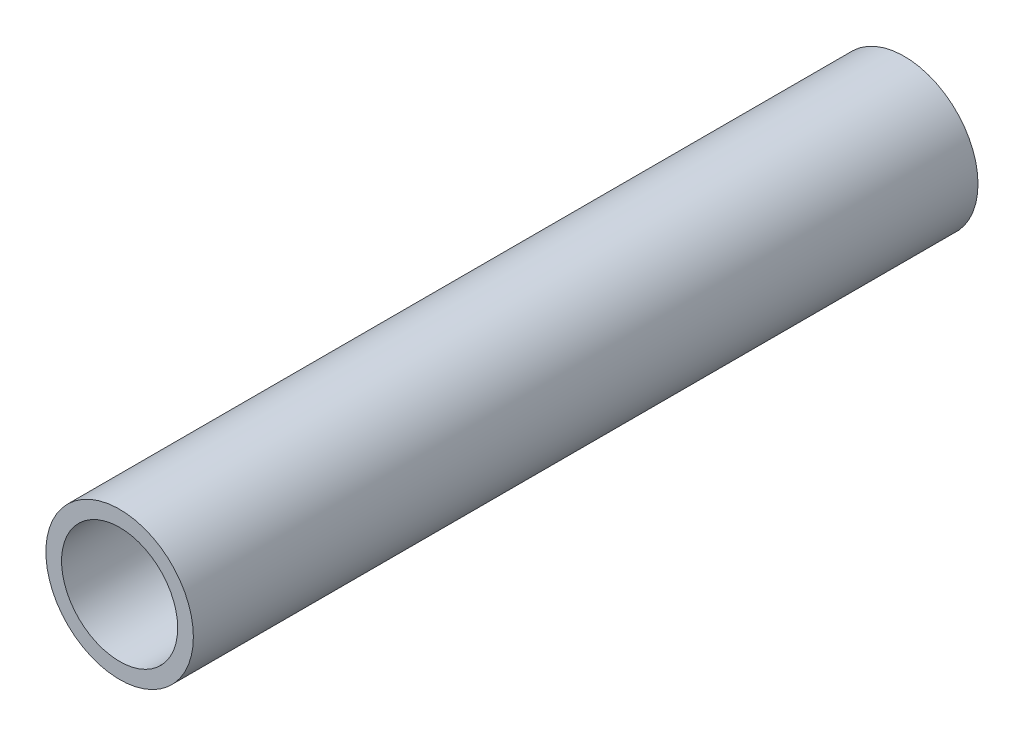
ISO-10303-21;
HEADER;
FILE_DESCRIPTION(('STEP AP214'),'2;1');
FILE_NAME('part.step','',(''),(''),'','','');
FILE_SCHEMA(('AUTOMOTIVE_DESIGN { 1 0 10303 214 1 1 1 1 }'));
ENDSEC;
DATA;
#1=APPLICATION_CONTEXT('core data for automotive mechanical design processes');
#2=APPLICATION_PROTOCOL_DEFINITION('international standard','automotive_design',2000,#1);
#3=PRODUCT_CONTEXT('',#1,'mechanical');
#4=PRODUCT('Part','Part','',(#3));
#5=PRODUCT_RELATED_PRODUCT_CATEGORY('part','',(#4));
#6=PRODUCT_DEFINITION_FORMATION('','',#4);
#7=PRODUCT_DEFINITION_CONTEXT('part definition',#1,'design');
#8=PRODUCT_DEFINITION('design','',#6,#7);
#9=PRODUCT_DEFINITION_SHAPE('','',#8);
#10=(LENGTH_UNIT() NAMED_UNIT(*) SI_UNIT(.MILLI.,.METRE.));
#11=(NAMED_UNIT(*) PLANE_ANGLE_UNIT() SI_UNIT($,.RADIAN.));
#12=(NAMED_UNIT(*) SI_UNIT($,.STERADIAN.) SOLID_ANGLE_UNIT());
#13=UNCERTAINTY_MEASURE_WITH_UNIT(LENGTH_MEASURE(1.E-05),#10,'distance_accuracy_value','');
#14=(GEOMETRIC_REPRESENTATION_CONTEXT(3) GLOBAL_UNCERTAINTY_ASSIGNED_CONTEXT((#13)) GLOBAL_UNIT_ASSIGNED_CONTEXT((#10,
#11,#12)) REPRESENTATION_CONTEXT('',''));
#15=CARTESIAN_POINT('',(0.,0.,0.));
#16=DIRECTION('',(0.,0.,1.));
#17=DIRECTION('',(1.,0.,0.));
#18=AXIS2_PLACEMENT_3D('',#15,#16,#17);
#19=CARTESIAN_POINT('',(0.,0.,12.7));
#20=DIRECTION('',(0.,0.,-1.));
#21=DIRECTION('',(-1.,0.,0.));
#22=AXIS2_PLACEMENT_3D('',#19,#20,#21);
#23=CYLINDRICAL_SURFACE('',#22,1.1938);
#24=CARTESIAN_POINT('',(0.,0.,12.7));
#25=DIRECTION('',(0.,0.,1.));
#26=DIRECTION('',(1.,0.,0.));
#27=AXIS2_PLACEMENT_3D('',#24,#25,#26);
#28=CIRCLE('',#27,1.1938);
#29=CARTESIAN_POINT('',(1.1938,0.,12.7));
#30=VERTEX_POINT('',#29);
#31=EDGE_CURVE('E10',#30,#30,#28,.T.);
#32=ORIENTED_EDGE('',*,*,#31,.F.);
#33=EDGE_LOOP('',(#32));
#34=FACE_BOUND('',#33,.T.);
#35=CARTESIAN_POINT('',(0.,0.,0.));
#36=DIRECTION('',(0.,0.,1.));
#37=DIRECTION('',(1.,0.,0.));
#38=AXIS2_PLACEMENT_3D('',#35,#36,#37);
#39=CIRCLE('',#38,1.1938);
#40=CARTESIAN_POINT('',(1.1938,0.,0.));
#41=VERTEX_POINT('',#40);
#42=EDGE_CURVE('E35',#41,#41,#39,.T.);
#43=ORIENTED_EDGE('',*,*,#42,.T.);
#44=EDGE_LOOP('',(#43));
#45=FACE_BOUND('',#44,.T.);
#46=ADVANCED_FACE('F32',(#34,#45),#23,.T.);
#47=CARTESIAN_POINT('',(0.,0.,12.7));
#48=DIRECTION('',(0.,0.,1.));
#49=DIRECTION('',(1.,0.,0.));
#50=AXIS2_PLACEMENT_3D('',#47,#48,#49);
#51=PLANE('',#50);
#52=CARTESIAN_POINT('',(0.,0.,12.7));
#53=DIRECTION('',(0.,0.,1.));
#54=DIRECTION('',(1.,0.,0.));
#55=AXIS2_PLACEMENT_3D('',#52,#53,#54);
#56=CIRCLE('',#55,0.9398);
#57=CARTESIAN_POINT('',(0.9398,0.,12.7));
#58=VERTEX_POINT('',#57);
#59=EDGE_CURVE('E42',#58,#58,#56,.T.);
#60=ORIENTED_EDGE('',*,*,#59,.F.);
#61=EDGE_LOOP('',(#60));
#62=FACE_BOUND('',#61,.T.);
#63=ORIENTED_EDGE('',*,*,#31,.T.);
#64=EDGE_LOOP('',(#63));
#65=FACE_BOUND('',#64,.T.);
#66=ADVANCED_FACE('F53',(#62,#65),#51,.T.);
#67=CARTESIAN_POINT('',(0.,0.,0.));
#68=DIRECTION('',(0.,0.,1.));
#69=DIRECTION('',(1.,0.,0.));
#70=AXIS2_PLACEMENT_3D('',#67,#68,#69);
#71=PLANE('',#70);
#72=CARTESIAN_POINT('',(0.,0.,0.));
#73=DIRECTION('',(0.,0.,1.));
#74=DIRECTION('',(1.,0.,0.));
#75=AXIS2_PLACEMENT_3D('',#72,#73,#74);
#76=CIRCLE('',#75,0.9398);
#77=CARTESIAN_POINT('',(0.9398,0.,0.));
#78=VERTEX_POINT('',#77);
#79=EDGE_CURVE('E44',#78,#78,#76,.T.);
#80=ORIENTED_EDGE('',*,*,#79,.T.);
#81=EDGE_LOOP('',(#80));
#82=FACE_BOUND('',#81,.T.);
#83=ORIENTED_EDGE('',*,*,#42,.F.);
#84=EDGE_LOOP('',(#83));
#85=FACE_BOUND('',#84,.T.);
#86=ADVANCED_FACE('F55',(#82,#85),#71,.F.);
#87=CARTESIAN_POINT('',(0.,0.,12.7));
#88=DIRECTION('',(0.,0.,-1.));
#89=DIRECTION('',(-1.,0.,0.));
#90=AXIS2_PLACEMENT_3D('',#87,#88,#89);
#91=CYLINDRICAL_SURFACE('',#90,0.9398);
#92=ORIENTED_EDGE('',*,*,#59,.T.);
#93=EDGE_LOOP('',(#92));
#94=FACE_BOUND('',#93,.T.);
#95=ORIENTED_EDGE('',*,*,#79,.F.);
#96=EDGE_LOOP('',(#95));
#97=FACE_BOUND('',#96,.T.);
#98=ADVANCED_FACE('F50',(#94,#97),#91,.F.);
#99=CLOSED_SHELL('',(#46,#66,#86,#98));
#100=MANIFOLD_SOLID_BREP('B2',#99);
#101=ADVANCED_BREP_SHAPE_REPRESENTATION('',(#18,#100),#14);
#102=SHAPE_DEFINITION_REPRESENTATION(#9,#101);
ENDSEC;
END-ISO-10303-21;
